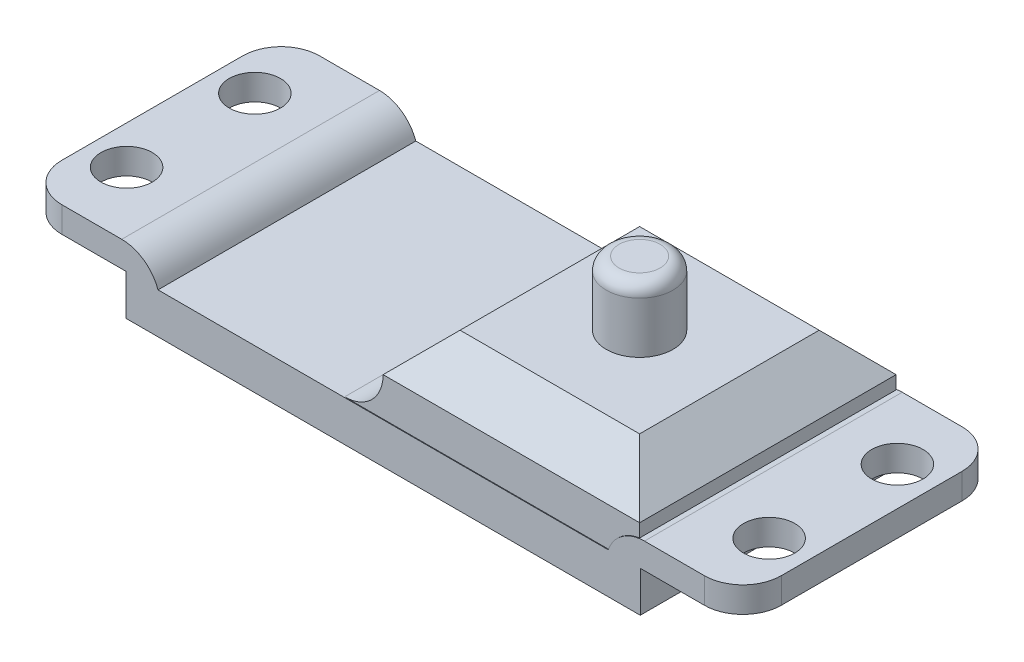
ISO-10303-21;
HEADER;
FILE_DESCRIPTION(('STEP AP214'),'2;1');
FILE_NAME('part.step','',(''),(''),'','','');
FILE_SCHEMA(('AUTOMOTIVE_DESIGN { 1 0 10303 214 1 1 1 1 }'));
ENDSEC;
DATA;
#1=APPLICATION_CONTEXT('core data for automotive mechanical design processes');
#2=APPLICATION_PROTOCOL_DEFINITION('international standard','automotive_design',2000,#1);
#3=PRODUCT_CONTEXT('',#1,'mechanical');
#4=PRODUCT('Part','Part','',(#3));
#5=PRODUCT_RELATED_PRODUCT_CATEGORY('part','',(#4));
#6=PRODUCT_DEFINITION_FORMATION('','',#4);
#7=PRODUCT_DEFINITION_CONTEXT('part definition',#1,'design');
#8=PRODUCT_DEFINITION('design','',#6,#7);
#9=PRODUCT_DEFINITION_SHAPE('','',#8);
#10=(LENGTH_UNIT() NAMED_UNIT(*) SI_UNIT(.MILLI.,.METRE.));
#11=(NAMED_UNIT(*) PLANE_ANGLE_UNIT() SI_UNIT($,.RADIAN.));
#12=(NAMED_UNIT(*) SI_UNIT($,.STERADIAN.) SOLID_ANGLE_UNIT());
#13=UNCERTAINTY_MEASURE_WITH_UNIT(LENGTH_MEASURE(1.E-05),#10,'distance_accuracy_value','');
#14=(GEOMETRIC_REPRESENTATION_CONTEXT(3) GLOBAL_UNCERTAINTY_ASSIGNED_CONTEXT((#13)) GLOBAL_UNIT_ASSIGNED_CONTEXT((#10,
#11,#12)) REPRESENTATION_CONTEXT('',''));
#15=CARTESIAN_POINT('',(0.,0.,0.));
#16=DIRECTION('',(0.,0.,1.));
#17=DIRECTION('',(1.,0.,0.));
#18=AXIS2_PLACEMENT_3D('',#15,#16,#17);
#19=CARTESIAN_POINT('',(0.,3.175,0.));
#20=DIRECTION('',(0.,-1.,0.));
#21=DIRECTION('',(0.,0.,-1.));
#22=AXIS2_PLACEMENT_3D('',#19,#20,#21);
#23=PLANE('',#22);
#24=DIRECTION('',(1.,0.,0.));
#25=VECTOR('',#24,1.);
#26=CARTESIAN_POINT('',(-0.0500000000000025,3.175,10.));
#27=LINE('',#26,#25);
#28=CARTESIAN_POINT('',(-3.05,3.175,10.));
#29=VERTEX_POINT('',#28);
#30=CARTESIAN_POINT('',(17.55,3.175,10.));
#31=VERTEX_POINT('',#30);
#32=EDGE_CURVE('E207',#29,#31,#27,.T.);
#33=ORIENTED_EDGE('',*,*,#32,.F.);
#34=DIRECTION('',(0.,0.,1.));
#35=VECTOR('',#34,1.);
#36=CARTESIAN_POINT('',(-3.05000000000001,3.175,-10.));
#37=LINE('',#36,#35);
#38=CARTESIAN_POINT('',(-3.05000000000001,3.175,-10.));
#39=VERTEX_POINT('',#38);
#40=EDGE_CURVE('E205',#29,#39,#37,.F.);
#41=ORIENTED_EDGE('',*,*,#40,.T.);
#42=DIRECTION('',(-1.,0.,0.));
#43=VECTOR('',#42,1.);
#44=CARTESIAN_POINT('',(-0.0500000000000049,3.175,-10.));
#45=LINE('',#44,#43);
#46=CARTESIAN_POINT('',(17.55,3.175,-10.));
#47=VERTEX_POINT('',#46);
#48=EDGE_CURVE('E190',#47,#39,#45,.T.);
#49=ORIENTED_EDGE('',*,*,#48,.F.);
#50=DIRECTION('',(0.,0.,1.));
#51=VECTOR('',#50,1.);
#52=CARTESIAN_POINT('',(17.55,3.175,-10.05));
#53=LINE('',#52,#51);
#54=CARTESIAN_POINT('',(17.55,3.175,-10.05));
#55=VERTEX_POINT('',#54);
#56=EDGE_CURVE('E202',#55,#47,#53,.T.);
#57=ORIENTED_EDGE('',*,*,#56,.F.);
#58=DIRECTION('',(-1.,0.,0.));
#59=VECTOR('',#58,1.);
#60=CARTESIAN_POINT('',(-20.05,3.175,-10.05));
#61=LINE('',#60,#59);
#62=CARTESIAN_POINT('',(-17.55,3.175,-10.05));
#63=VERTEX_POINT('',#62);
#64=EDGE_CURVE('E223',#55,#63,#61,.T.);
#65=ORIENTED_EDGE('',*,*,#64,.T.);
#66=DIRECTION('',(0.,0.,1.));
#67=VECTOR('',#66,1.);
#68=CARTESIAN_POINT('',(-17.55,3.175,-10.05));
#69=LINE('',#68,#67);
#70=CARTESIAN_POINT('',(-17.55,3.175,10.05));
#71=VERTEX_POINT('',#70);
#72=EDGE_CURVE('E466',#63,#71,#69,.T.);
#73=ORIENTED_EDGE('',*,*,#72,.T.);
#74=DIRECTION('',(1.,0.,0.));
#75=VECTOR('',#74,1.);
#76=CARTESIAN_POINT('',(-20.05,3.175,10.05));
#77=LINE('',#76,#75);
#78=CARTESIAN_POINT('',(17.55,3.175,10.05));
#79=VERTEX_POINT('',#78);
#80=EDGE_CURVE('E225',#71,#79,#77,.T.);
#81=ORIENTED_EDGE('',*,*,#80,.T.);
#82=EDGE_CURVE('E216',#31,#79,#53,.T.);
#83=ORIENTED_EDGE('',*,*,#82,.F.);
#84=EDGE_LOOP('',(#33,#41,#49,#57,#65,#73,#81,#83));
#85=FACE_BOUND('',#84,.T.);
#86=ADVANCED_FACE('F32',(#85),#23,.F.);
#87=CARTESIAN_POINT('',(20.3784271247462,2.175,-10.05));
#88=DIRECTION('',(0.,0.,-1.));
#89=DIRECTION('',(-1.,0.,0.));
#90=AXIS2_PLACEMENT_3D('',#87,#88,#89);
#91=CYLINDRICAL_SURFACE('',#90,3.);
#92=ORIENTED_EDGE('',*,*,#56,.T.);
#93=CARTESIAN_POINT('',(20.3784271247462,2.175,-10.));
#94=DIRECTION('',(0.,0.,1.));
#95=DIRECTION('',(1.,0.,0.));
#96=AXIS2_PLACEMENT_3D('',#93,#94,#95);
#97=CIRCLE('',#96,3.);
#98=CARTESIAN_POINT('',(19.95,5.14425078071585,-10.));
#99=VERTEX_POINT('',#98);
#100=EDGE_CURVE('E187',#47,#99,#97,.F.);
#101=ORIENTED_EDGE('',*,*,#100,.T.);
#102=DIRECTION('',(0.,0.,-1.));
#103=VECTOR('',#102,1.);
#104=CARTESIAN_POINT('',(19.95,5.14425078071585,-10.05));
#105=LINE('',#104,#103);
#106=CARTESIAN_POINT('',(19.95,5.14425078071586,10.));
#107=VERTEX_POINT('',#106);
#108=EDGE_CURVE('E198',#99,#107,#105,.F.);
#109=ORIENTED_EDGE('',*,*,#108,.T.);
#110=CARTESIAN_POINT('',(20.3784271247462,2.175,10.));
#111=DIRECTION('',(0.,0.,-1.));
#112=DIRECTION('',(-1.,0.,0.));
#113=AXIS2_PLACEMENT_3D('',#110,#111,#112);
#114=CIRCLE('',#113,3.);
#115=EDGE_CURVE('E314',#107,#31,#114,.F.);
#116=ORIENTED_EDGE('',*,*,#115,.T.);
#117=ORIENTED_EDGE('',*,*,#82,.T.);
#118=CARTESIAN_POINT('',(20.3784271247462,2.175,10.05));
#119=DIRECTION('',(0.,0.,-1.));
#120=DIRECTION('',(-1.,0.,0.));
#121=AXIS2_PLACEMENT_3D('',#118,#119,#120);
#122=CIRCLE('',#121,3.);
#123=CARTESIAN_POINT('',(20.3784271247462,5.175,10.05));
#124=VERTEX_POINT('',#123);
#125=EDGE_CURVE('E259',#124,#79,#122,.F.);
#126=ORIENTED_EDGE('',*,*,#125,.F.);
#127=DIRECTION('',(0.,0.,-1.));
#128=VECTOR('',#127,1.);
#129=CARTESIAN_POINT('',(20.3784271247462,5.175,0.));
#130=LINE('',#129,#128);
#131=CARTESIAN_POINT('',(20.3784271247462,5.175,-10.05));
#132=VERTEX_POINT('',#131);
#133=EDGE_CURVE('E248',#132,#124,#130,.F.);
#134=ORIENTED_EDGE('',*,*,#133,.F.);
#135=CARTESIAN_POINT('',(20.3784271247462,2.175,-10.05));
#136=DIRECTION('',(0.,0.,1.));
#137=DIRECTION('',(1.,0.,0.));
#138=AXIS2_PLACEMENT_3D('',#135,#136,#137);
#139=CIRCLE('',#138,3.);
#140=EDGE_CURVE('E214',#55,#132,#139,.F.);
#141=ORIENTED_EDGE('',*,*,#140,.F.);
#142=EDGE_LOOP('',(#92,#101,#109,#116,#117,#126,#134,#141));
#143=FACE_BOUND('',#142,.T.);
#144=ADVANCED_FACE('F211',(#143),#91,.T.);
#145=CARTESIAN_POINT('',(20.05,3.175,10.05));
#146=DIRECTION('',(-1.,0.,0.));
#147=DIRECTION('',(0.,0.,1.));
#148=AXIS2_PLACEMENT_3D('',#145,#146,#147);
#149=PLANE('',#148);
#150=DIRECTION('',(0.,0.,-1.));
#151=VECTOR('',#150,1.);
#152=CARTESIAN_POINT('',(20.05,3.175,10.05));
#153=LINE('',#152,#151);
#154=CARTESIAN_POINT('',(20.05,3.175,10.05));
#155=VERTEX_POINT('',#154);
#156=CARTESIAN_POINT('',(20.05,3.175,-10.05));
#157=VERTEX_POINT('',#156);
#158=EDGE_CURVE('E256',#155,#157,#153,.T.);
#159=ORIENTED_EDGE('',*,*,#158,.F.);
#160=DIRECTION('',(0.,-1.,0.));
#161=VECTOR('',#160,1.);
#162=CARTESIAN_POINT('',(20.05,3.175,10.05));
#163=LINE('',#162,#161);
#164=CARTESIAN_POINT('',(20.05,0.,10.05));
#165=VERTEX_POINT('',#164);
#166=EDGE_CURVE('E229',#155,#165,#163,.T.);
#167=ORIENTED_EDGE('',*,*,#166,.T.);
#168=DIRECTION('',(0.,0.,-1.));
#169=VECTOR('',#168,1.);
#170=CARTESIAN_POINT('',(20.05,0.,10.05));
#171=LINE('',#170,#169);
#172=CARTESIAN_POINT('',(20.05,0.,-10.05));
#173=VERTEX_POINT('',#172);
#174=EDGE_CURVE('E230',#165,#173,#171,.T.);
#175=ORIENTED_EDGE('',*,*,#174,.T.);
#176=DIRECTION('',(0.,-1.,0.));
#177=VECTOR('',#176,1.);
#178=CARTESIAN_POINT('',(20.05,3.175,-10.05));
#179=LINE('',#178,#177);
#180=EDGE_CURVE('E246',#157,#173,#179,.T.);
#181=ORIENTED_EDGE('',*,*,#180,.F.);
#182=EDGE_LOOP('',(#159,#167,#175,#181));
#183=FACE_BOUND('',#182,.T.);
#184=ADVANCED_FACE('F368',(#183),#149,.F.);
#185=CARTESIAN_POINT('',(-20.05,3.175,-10.05));
#186=DIRECTION('',(0.,0.,1.));
#187=DIRECTION('',(1.,0.,0.));
#188=AXIS2_PLACEMENT_3D('',#185,#186,#187);
#189=PLANE('',#188);
#190=DIRECTION('',(1.,0.,0.));
#191=VECTOR('',#190,1.);
#192=CARTESIAN_POINT('',(-28.05,3.175,-10.05));
#193=LINE('',#192,#191);
#194=CARTESIAN_POINT('',(-25.05,3.175,-10.05));
#195=VERTEX_POINT('',#194);
#196=CARTESIAN_POINT('',(-20.05,3.175,-10.05));
#197=VERTEX_POINT('',#196);
#198=EDGE_CURVE('E464',#195,#197,#193,.T.);
#199=ORIENTED_EDGE('',*,*,#198,.F.);
#200=DIRECTION('',(0.,1.,0.));
#201=VECTOR('',#200,1.);
#202=CARTESIAN_POINT('',(-25.05,5.175,-10.05));
#203=LINE('',#202,#201);
#204=CARTESIAN_POINT('',(-25.05,5.175,-10.05));
#205=VERTEX_POINT('',#204);
#206=EDGE_CURVE('E296',#195,#205,#203,.T.);
#207=ORIENTED_EDGE('',*,*,#206,.T.);
#208=DIRECTION('',(1.,0.,0.));
#209=VECTOR('',#208,1.);
#210=CARTESIAN_POINT('',(-20.05,5.175,-10.05));
#211=LINE('',#210,#209);
#212=CARTESIAN_POINT('',(-20.3784271247462,5.175,-10.05));
#213=VERTEX_POINT('',#212);
#214=EDGE_CURVE('E470',#205,#213,#211,.T.);
#215=ORIENTED_EDGE('',*,*,#214,.T.);
#216=CARTESIAN_POINT('',(-20.3784271247462,2.175,-10.05));
#217=DIRECTION('',(0.,0.,1.));
#218=DIRECTION('',(1.,0.,0.));
#219=AXIS2_PLACEMENT_3D('',#216,#217,#218);
#220=CIRCLE('',#219,3.);
#221=EDGE_CURVE('E294',#213,#63,#220,.F.);
#222=ORIENTED_EDGE('',*,*,#221,.T.);
#223=ORIENTED_EDGE('',*,*,#64,.F.);
#224=ORIENTED_EDGE('',*,*,#140,.T.);
#225=DIRECTION('',(-1.,0.,0.));
#226=VECTOR('',#225,1.);
#227=CARTESIAN_POINT('',(20.05,5.175,-10.05));
#228=LINE('',#227,#226);
#229=CARTESIAN_POINT('',(25.05,5.175,-10.05));
#230=VERTEX_POINT('',#229);
#231=EDGE_CURVE('E215',#230,#132,#228,.T.);
#232=ORIENTED_EDGE('',*,*,#231,.F.);
#233=DIRECTION('',(0.,1.,0.));
#234=VECTOR('',#233,1.);
#235=CARTESIAN_POINT('',(25.05,3.175,-10.05));
#236=LINE('',#235,#234);
#237=CARTESIAN_POINT('',(25.05,3.175,-10.05));
#238=VERTEX_POINT('',#237);
#239=EDGE_CURVE('E273',#230,#238,#236,.F.);
#240=ORIENTED_EDGE('',*,*,#239,.T.);
#241=DIRECTION('',(-1.,0.,0.));
#242=VECTOR('',#241,1.);
#243=CARTESIAN_POINT('',(28.05,3.175,-10.05));
#244=LINE('',#243,#242);
#245=EDGE_CURVE('E485',#238,#157,#244,.T.);
#246=ORIENTED_EDGE('',*,*,#245,.T.);
#247=ORIENTED_EDGE('',*,*,#180,.T.);
#248=DIRECTION('',(-1.,0.,0.));
#249=VECTOR('',#248,1.);
#250=CARTESIAN_POINT('',(-20.05,0.,-10.05));
#251=LINE('',#250,#249);
#252=CARTESIAN_POINT('',(-20.05,0.,-10.05));
#253=VERTEX_POINT('',#252);
#254=EDGE_CURVE('E233',#173,#253,#251,.T.);
#255=ORIENTED_EDGE('',*,*,#254,.T.);
#256=DIRECTION('',(0.,-1.,0.));
#257=VECTOR('',#256,1.);
#258=CARTESIAN_POINT('',(-20.05,3.175,-10.05));
#259=LINE('',#258,#257);
#260=EDGE_CURVE('E244',#197,#253,#259,.T.);
#261=ORIENTED_EDGE('',*,*,#260,.F.);
#262=EDGE_LOOP('',(#199,#207,#215,#222,#223,#224,#232,#240,#246,#247,#255,#261));
#263=FACE_BOUND('',#262,.T.);
#264=ADVANCED_FACE('F385',(#263),#189,.F.);
#265=CARTESIAN_POINT('',(-20.05,3.175,10.05));
#266=DIRECTION('',(1.,0.,0.));
#267=DIRECTION('',(0.,0.,-1.));
#268=AXIS2_PLACEMENT_3D('',#265,#266,#267);
#269=PLANE('',#268);
#270=DIRECTION('',(0.,-1.,0.));
#271=VECTOR('',#270,1.);
#272=CARTESIAN_POINT('',(-20.05,3.175,10.05));
#273=LINE('',#272,#271);
#274=CARTESIAN_POINT('',(-20.05,3.175,10.05));
#275=VERTEX_POINT('',#274);
#276=CARTESIAN_POINT('',(-20.05,0.,10.05));
#277=VERTEX_POINT('',#276);
#278=EDGE_CURVE('E242',#275,#277,#273,.T.);
#279=ORIENTED_EDGE('',*,*,#278,.F.);
#280=DIRECTION('',(0.,0.,-1.));
#281=VECTOR('',#280,1.);
#282=CARTESIAN_POINT('',(-20.05,3.175,10.05));
#283=LINE('',#282,#281);
#284=EDGE_CURVE('E289',#275,#197,#283,.T.);
#285=ORIENTED_EDGE('',*,*,#284,.T.);
#286=ORIENTED_EDGE('',*,*,#260,.T.);
#287=DIRECTION('',(0.,0.,1.));
#288=VECTOR('',#287,1.);
#289=CARTESIAN_POINT('',(-20.05,0.,10.05));
#290=LINE('',#289,#288);
#291=EDGE_CURVE('E236',#253,#277,#290,.T.);
#292=ORIENTED_EDGE('',*,*,#291,.T.);
#293=EDGE_LOOP('',(#279,#285,#286,#292));
#294=FACE_BOUND('',#293,.T.);
#295=ADVANCED_FACE('F381',(#294),#269,.F.);
#296=CARTESIAN_POINT('',(-20.05,3.175,10.05));
#297=DIRECTION('',(0.,0.,-1.));
#298=DIRECTION('',(-1.,0.,0.));
#299=AXIS2_PLACEMENT_3D('',#296,#297,#298);
#300=PLANE('',#299);
#301=DIRECTION('',(-1.,0.,0.));
#302=VECTOR('',#301,1.);
#303=CARTESIAN_POINT('',(-20.05,5.175,10.05));
#304=LINE('',#303,#302);
#305=CARTESIAN_POINT('',(-20.3784271247462,5.175,10.05));
#306=VERTEX_POINT('',#305);
#307=CARTESIAN_POINT('',(-25.05,5.175,10.05));
#308=VERTEX_POINT('',#307);
#309=EDGE_CURVE('E467',#306,#308,#304,.T.);
#310=ORIENTED_EDGE('',*,*,#309,.T.);
#311=DIRECTION('',(0.,-1.,0.));
#312=VECTOR('',#311,1.);
#313=CARTESIAN_POINT('',(-25.05,3.175,10.05));
#314=LINE('',#313,#312);
#315=CARTESIAN_POINT('',(-25.05,3.175,10.05));
#316=VERTEX_POINT('',#315);
#317=EDGE_CURVE('E311',#308,#316,#314,.T.);
#318=ORIENTED_EDGE('',*,*,#317,.T.);
#319=DIRECTION('',(1.,0.,0.));
#320=VECTOR('',#319,1.);
#321=CARTESIAN_POINT('',(-28.05,3.175,10.05));
#322=LINE('',#321,#320);
#323=EDGE_CURVE('E460',#316,#275,#322,.T.);
#324=ORIENTED_EDGE('',*,*,#323,.T.);
#325=ORIENTED_EDGE('',*,*,#278,.T.);
#326=DIRECTION('',(1.,0.,0.));
#327=VECTOR('',#326,1.);
#328=CARTESIAN_POINT('',(-20.05,0.,10.05));
#329=LINE('',#328,#327);
#330=EDGE_CURVE('E226',#277,#165,#329,.T.);
#331=ORIENTED_EDGE('',*,*,#330,.T.);
#332=ORIENTED_EDGE('',*,*,#166,.F.);
#333=DIRECTION('',(-1.,0.,0.));
#334=VECTOR('',#333,1.);
#335=CARTESIAN_POINT('',(28.05,3.175,10.05));
#336=LINE('',#335,#334);
#337=CARTESIAN_POINT('',(25.05,3.175,10.05));
#338=VERTEX_POINT('',#337);
#339=EDGE_CURVE('E220',#338,#155,#336,.T.);
#340=ORIENTED_EDGE('',*,*,#339,.F.);
#341=DIRECTION('',(0.,-1.,0.));
#342=VECTOR('',#341,1.);
#343=CARTESIAN_POINT('',(25.05,5.175,10.05));
#344=LINE('',#343,#342);
#345=CARTESIAN_POINT('',(25.05,5.175,10.05));
#346=VERTEX_POINT('',#345);
#347=EDGE_CURVE('E279',#338,#346,#344,.F.);
#348=ORIENTED_EDGE('',*,*,#347,.T.);
#349=DIRECTION('',(1.,0.,0.));
#350=VECTOR('',#349,1.);
#351=CARTESIAN_POINT('',(20.05,5.175,10.05));
#352=LINE('',#351,#350);
#353=EDGE_CURVE('E218',#124,#346,#352,.T.);
#354=ORIENTED_EDGE('',*,*,#353,.F.);
#355=ORIENTED_EDGE('',*,*,#125,.T.);
#356=ORIENTED_EDGE('',*,*,#80,.F.);
#357=CARTESIAN_POINT('',(-20.3784271247462,2.175,10.05));
#358=DIRECTION('',(0.,0.,-1.));
#359=DIRECTION('',(-1.,0.,0.));
#360=AXIS2_PLACEMENT_3D('',#357,#358,#359);
#361=CIRCLE('',#360,3.);
#362=EDGE_CURVE('E281',#71,#306,#361,.F.);
#363=ORIENTED_EDGE('',*,*,#362,.T.);
#364=EDGE_LOOP('',(#310,#318,#324,#325,#331,#332,#340,#348,#354,#355,#356,#363));
#365=FACE_BOUND('',#364,.T.);
#366=ADVANCED_FACE('F377',(#365),#300,.F.);
#367=CARTESIAN_POINT('',(0.,0.,0.));
#368=DIRECTION('',(0.,-1.,0.));
#369=DIRECTION('',(0.,0.,-1.));
#370=AXIS2_PLACEMENT_3D('',#367,#368,#369);
#371=PLANE('',#370);
#372=ORIENTED_EDGE('',*,*,#174,.F.);
#373=ORIENTED_EDGE('',*,*,#330,.F.);
#374=ORIENTED_EDGE('',*,*,#291,.F.);
#375=ORIENTED_EDGE('',*,*,#254,.F.);
#376=EDGE_LOOP('',(#372,#373,#374,#375));
#377=FACE_BOUND('',#376,.T.);
#378=ADVANCED_FACE('F374',(#377),#371,.T.);
#379=CARTESIAN_POINT('',(0.,5.175,0.));
#380=DIRECTION('',(0.,-1.,0.));
#381=DIRECTION('',(0.,0.,-1.));
#382=AXIS2_PLACEMENT_3D('',#379,#380,#381);
#383=PLANE('',#382);
#384=CARTESIAN_POINT('',(25.05,5.175,5.));
#385=DIRECTION('',(0.,-1.,0.));
#386=DIRECTION('',(0.,0.,-1.));
#387=AXIS2_PLACEMENT_3D('',#384,#385,#386);
#388=CIRCLE('',#387,2.);
#389=CARTESIAN_POINT('',(25.05,5.175,3.));
#390=VERTEX_POINT('',#389);
#391=EDGE_CURVE('E253',#390,#390,#388,.T.);
#392=ORIENTED_EDGE('',*,*,#391,.T.);
#393=EDGE_LOOP('',(#392));
#394=FACE_BOUND('',#393,.T.);
#395=CARTESIAN_POINT('',(25.05,5.175,-5.));
#396=DIRECTION('',(0.,-1.,0.));
#397=DIRECTION('',(0.,0.,-1.));
#398=AXIS2_PLACEMENT_3D('',#395,#396,#397);
#399=CIRCLE('',#398,2.);
#400=CARTESIAN_POINT('',(25.05,5.175,-7.));
#401=VERTEX_POINT('',#400);
#402=EDGE_CURVE('E472',#401,#401,#399,.T.);
#403=ORIENTED_EDGE('',*,*,#402,.T.);
#404=EDGE_LOOP('',(#403));
#405=FACE_BOUND('',#404,.T.);
#406=DIRECTION('',(0.,0.,1.));
#407=VECTOR('',#406,1.);
#408=CARTESIAN_POINT('',(28.05,5.175,10.05));
#409=LINE('',#408,#407);
#410=CARTESIAN_POINT('',(28.05,5.175,-7.05));
#411=VERTEX_POINT('',#410);
#412=CARTESIAN_POINT('',(28.05,5.175,7.05));
#413=VERTEX_POINT('',#412);
#414=EDGE_CURVE('E482',#411,#413,#409,.T.);
#415=ORIENTED_EDGE('',*,*,#414,.F.);
#416=CARTESIAN_POINT('',(25.05,5.175,-7.05));
#417=DIRECTION('',(0.,-1.,0.));
#418=DIRECTION('',(0.,0.,-1.));
#419=AXIS2_PLACEMENT_3D('',#416,#417,#418);
#420=CIRCLE('',#419,3.);
#421=EDGE_CURVE('E271',#411,#230,#420,.F.);
#422=ORIENTED_EDGE('',*,*,#421,.T.);
#423=ORIENTED_EDGE('',*,*,#231,.T.);
#424=ORIENTED_EDGE('',*,*,#133,.T.);
#425=ORIENTED_EDGE('',*,*,#353,.T.);
#426=CARTESIAN_POINT('',(25.05,5.175,7.05));
#427=DIRECTION('',(0.,-1.,0.));
#428=DIRECTION('',(0.,0.,-1.));
#429=AXIS2_PLACEMENT_3D('',#426,#427,#428);
#430=CIRCLE('',#429,3.);
#431=EDGE_CURVE('E269',#346,#413,#430,.F.);
#432=ORIENTED_EDGE('',*,*,#431,.T.);
#433=EDGE_LOOP('',(#415,#422,#423,#424,#425,#432));
#434=FACE_BOUND('',#433,.T.);
#435=ADVANCED_FACE('F372',(#394,#405,#434),#383,.F.);
#436=CARTESIAN_POINT('',(28.05,3.175,10.05));
#437=DIRECTION('',(0.,1.,0.));
#438=DIRECTION('',(0.,0.,1.));
#439=AXIS2_PLACEMENT_3D('',#436,#437,#438);
#440=PLANE('',#439);
#441=CARTESIAN_POINT('',(25.05,3.175,5.));
#442=DIRECTION('',(0.,1.,0.));
#443=DIRECTION('',(0.,0.,1.));
#444=AXIS2_PLACEMENT_3D('',#441,#442,#443);
#445=CIRCLE('',#444,2.);
#446=CARTESIAN_POINT('',(25.05,3.175,7.));
#447=VERTEX_POINT('',#446);
#448=EDGE_CURVE('E252',#447,#447,#445,.T.);
#449=ORIENTED_EDGE('',*,*,#448,.T.);
#450=EDGE_LOOP('',(#449));
#451=FACE_BOUND('',#450,.T.);
#452=CARTESIAN_POINT('',(25.05,3.175,-5.));
#453=DIRECTION('',(0.,1.,0.));
#454=DIRECTION('',(0.,0.,1.));
#455=AXIS2_PLACEMENT_3D('',#452,#453,#454);
#456=CIRCLE('',#455,2.);
#457=CARTESIAN_POINT('',(25.05,3.175,-3.));
#458=VERTEX_POINT('',#457);
#459=EDGE_CURVE('E249',#458,#458,#456,.T.);
#460=ORIENTED_EDGE('',*,*,#459,.T.);
#461=EDGE_LOOP('',(#460));
#462=FACE_BOUND('',#461,.T.);
#463=ORIENTED_EDGE('',*,*,#245,.F.);
#464=CARTESIAN_POINT('',(25.05,3.175,-7.05));
#465=DIRECTION('',(0.,1.,0.));
#466=DIRECTION('',(0.,0.,1.));
#467=AXIS2_PLACEMENT_3D('',#464,#465,#466);
#468=CIRCLE('',#467,3.);
#469=CARTESIAN_POINT('',(28.05,3.175,-7.05));
#470=VERTEX_POINT('',#469);
#471=EDGE_CURVE('E277',#238,#470,#468,.F.);
#472=ORIENTED_EDGE('',*,*,#471,.T.);
#473=DIRECTION('',(0.,0.,-1.));
#474=VECTOR('',#473,1.);
#475=CARTESIAN_POINT('',(28.05,3.175,10.05));
#476=LINE('',#475,#474);
#477=CARTESIAN_POINT('',(28.05,3.175,7.05));
#478=VERTEX_POINT('',#477);
#479=EDGE_CURVE('E479',#478,#470,#476,.T.);
#480=ORIENTED_EDGE('',*,*,#479,.F.);
#481=CARTESIAN_POINT('',(25.05,3.175,7.05));
#482=DIRECTION('',(0.,1.,0.));
#483=DIRECTION('',(0.,0.,1.));
#484=AXIS2_PLACEMENT_3D('',#481,#482,#483);
#485=CIRCLE('',#484,3.);
#486=EDGE_CURVE('E275',#478,#338,#485,.F.);
#487=ORIENTED_EDGE('',*,*,#486,.T.);
#488=ORIENTED_EDGE('',*,*,#339,.T.);
#489=ORIENTED_EDGE('',*,*,#158,.T.);
#490=EDGE_LOOP('',(#463,#472,#480,#487,#488,#489));
#491=FACE_BOUND('',#490,.T.);
#492=ADVANCED_FACE('F493',(#451,#462,#491),#440,.F.);
#493=CARTESIAN_POINT('',(28.05,0.,0.));
#494=DIRECTION('',(1.,0.,0.));
#495=DIRECTION('',(0.,0.,-1.));
#496=AXIS2_PLACEMENT_3D('',#493,#494,#495);
#497=PLANE('',#496);
#498=ORIENTED_EDGE('',*,*,#479,.T.);
#499=DIRECTION('',(0.,1.,0.));
#500=VECTOR('',#499,1.);
#501=CARTESIAN_POINT('',(28.05,5.175,-7.05));
#502=LINE('',#501,#500);
#503=EDGE_CURVE('E266',#470,#411,#502,.T.);
#504=ORIENTED_EDGE('',*,*,#503,.T.);
#505=ORIENTED_EDGE('',*,*,#414,.T.);
#506=DIRECTION('',(0.,-1.,0.));
#507=VECTOR('',#506,1.);
#508=CARTESIAN_POINT('',(28.05,3.175,7.05));
#509=LINE('',#508,#507);
#510=EDGE_CURVE('E263',#413,#478,#509,.T.);
#511=ORIENTED_EDGE('',*,*,#510,.T.);
#512=EDGE_LOOP('',(#498,#504,#505,#511));
#513=FACE_BOUND('',#512,.T.);
#514=ADVANCED_FACE('F511',(#513),#497,.T.);
#515=CARTESIAN_POINT('',(25.05,5.175,-5.));
#516=DIRECTION('',(0.,-1.,0.));
#517=DIRECTION('',(0.,0.,-1.));
#518=AXIS2_PLACEMENT_3D('',#515,#516,#517);
#519=CYLINDRICAL_SURFACE('',#518,2.);
#520=ORIENTED_EDGE('',*,*,#402,.F.);
#521=EDGE_LOOP('',(#520));
#522=FACE_BOUND('',#521,.T.);
#523=ORIENTED_EDGE('',*,*,#459,.F.);
#524=EDGE_LOOP('',(#523));
#525=FACE_BOUND('',#524,.T.);
#526=ADVANCED_FACE('F557',(#522,#525),#519,.F.);
#527=CARTESIAN_POINT('',(25.05,5.175,5.));
#528=DIRECTION('',(0.,-1.,0.));
#529=DIRECTION('',(0.,0.,-1.));
#530=AXIS2_PLACEMENT_3D('',#527,#528,#529);
#531=CYLINDRICAL_SURFACE('',#530,2.);
#532=ORIENTED_EDGE('',*,*,#391,.F.);
#533=EDGE_LOOP('',(#532));
#534=FACE_BOUND('',#533,.T.);
#535=ORIENTED_EDGE('',*,*,#448,.F.);
#536=EDGE_LOOP('',(#535));
#537=FACE_BOUND('',#536,.T.);
#538=ADVANCED_FACE('F397',(#534,#537),#531,.F.);
#539=CARTESIAN_POINT('',(25.05,0.,-7.05));
#540=DIRECTION('',(0.,-1.,0.));
#541=DIRECTION('',(0.,0.,-1.));
#542=AXIS2_PLACEMENT_3D('',#539,#540,#541);
#543=CYLINDRICAL_SURFACE('',#542,3.);
#544=ORIENTED_EDGE('',*,*,#471,.F.);
#545=ORIENTED_EDGE('',*,*,#239,.F.);
#546=ORIENTED_EDGE('',*,*,#421,.F.);
#547=ORIENTED_EDGE('',*,*,#503,.F.);
#548=EDGE_LOOP('',(#544,#545,#546,#547));
#549=FACE_BOUND('',#548,.T.);
#550=ADVANCED_FACE('F393',(#549),#543,.T.);
#551=CARTESIAN_POINT('',(25.05,0.,7.05));
#552=DIRECTION('',(0.,1.,0.));
#553=DIRECTION('',(0.,0.,1.));
#554=AXIS2_PLACEMENT_3D('',#551,#552,#553);
#555=CYLINDRICAL_SURFACE('',#554,3.);
#556=ORIENTED_EDGE('',*,*,#431,.F.);
#557=ORIENTED_EDGE('',*,*,#347,.F.);
#558=ORIENTED_EDGE('',*,*,#486,.F.);
#559=ORIENTED_EDGE('',*,*,#510,.F.);
#560=EDGE_LOOP('',(#556,#557,#558,#559));
#561=FACE_BOUND('',#560,.T.);
#562=ADVANCED_FACE('F396',(#561),#555,.T.);
#563=CARTESIAN_POINT('',(0.,5.175,0.));
#564=DIRECTION('',(0.,-1.,0.));
#565=DIRECTION('',(0.,0.,-1.));
#566=AXIS2_PLACEMENT_3D('',#563,#564,#565);
#567=PLANE('',#566);
#568=CARTESIAN_POINT('',(-25.05,5.175,5.));
#569=DIRECTION('',(0.,1.,0.));
#570=DIRECTION('',(0.,0.,-1.));
#571=AXIS2_PLACEMENT_3D('',#568,#569,#570);
#572=CIRCLE('',#571,2.);
#573=CARTESIAN_POINT('',(-25.05,5.175,3.));
#574=VERTEX_POINT('',#573);
#575=EDGE_CURVE('E286',#574,#574,#572,.T.);
#576=ORIENTED_EDGE('',*,*,#575,.F.);
#577=EDGE_LOOP('',(#576));
#578=FACE_BOUND('',#577,.T.);
#579=CARTESIAN_POINT('',(-25.05,5.175,-5.));
#580=DIRECTION('',(0.,1.,0.));
#581=DIRECTION('',(0.,0.,-1.));
#582=AXIS2_PLACEMENT_3D('',#579,#580,#581);
#583=CIRCLE('',#582,2.);
#584=CARTESIAN_POINT('',(-25.05,5.175,-7.));
#585=VERTEX_POINT('',#584);
#586=EDGE_CURVE('E446',#585,#585,#583,.T.);
#587=ORIENTED_EDGE('',*,*,#586,.F.);
#588=EDGE_LOOP('',(#587));
#589=FACE_BOUND('',#588,.T.);
#590=ORIENTED_EDGE('',*,*,#214,.F.);
#591=CARTESIAN_POINT('',(-25.05,5.175,-7.05));
#592=DIRECTION('',(0.,-1.,0.));
#593=DIRECTION('',(0.,0.,-1.));
#594=AXIS2_PLACEMENT_3D('',#591,#592,#593);
#595=CIRCLE('',#594,3.);
#596=CARTESIAN_POINT('',(-28.05,5.175,-7.05));
#597=VERTEX_POINT('',#596);
#598=EDGE_CURVE('E301',#205,#597,#595,.F.);
#599=ORIENTED_EDGE('',*,*,#598,.T.);
#600=DIRECTION('',(0.,0.,1.));
#601=VECTOR('',#600,1.);
#602=CARTESIAN_POINT('',(-28.05,5.175,10.05));
#603=LINE('',#602,#601);
#604=CARTESIAN_POINT('',(-28.05,5.175,7.05));
#605=VERTEX_POINT('',#604);
#606=EDGE_CURVE('E454',#597,#605,#603,.T.);
#607=ORIENTED_EDGE('',*,*,#606,.T.);
#608=CARTESIAN_POINT('',(-25.05,5.175,7.05));
#609=DIRECTION('',(0.,-1.,0.));
#610=DIRECTION('',(0.,0.,-1.));
#611=AXIS2_PLACEMENT_3D('',#608,#609,#610);
#612=CIRCLE('',#611,3.);
#613=EDGE_CURVE('E299',#605,#308,#612,.F.);
#614=ORIENTED_EDGE('',*,*,#613,.T.);
#615=ORIENTED_EDGE('',*,*,#309,.F.);
#616=DIRECTION('',(0.,0.,-1.));
#617=VECTOR('',#616,1.);
#618=CARTESIAN_POINT('',(-20.3784271247462,5.175,0.));
#619=LINE('',#618,#617);
#620=EDGE_CURVE('E291',#306,#213,#619,.T.);
#621=ORIENTED_EDGE('',*,*,#620,.T.);
#622=EDGE_LOOP('',(#590,#599,#607,#614,#615,#621));
#623=FACE_BOUND('',#622,.T.);
#624=ADVANCED_FACE('F401',(#578,#589,#623),#567,.F.);
#625=CARTESIAN_POINT('',(-28.05,3.175,10.05));
#626=DIRECTION('',(0.,-1.,0.));
#627=DIRECTION('',(0.,0.,-1.));
#628=AXIS2_PLACEMENT_3D('',#625,#626,#627);
#629=PLANE('',#628);
#630=CARTESIAN_POINT('',(-25.05,3.175,5.));
#631=DIRECTION('',(0.,-1.,0.));
#632=DIRECTION('',(0.,0.,-1.));
#633=AXIS2_PLACEMENT_3D('',#630,#631,#632);
#634=CIRCLE('',#633,2.);
#635=CARTESIAN_POINT('',(-25.05,3.175,3.));
#636=VERTEX_POINT('',#635);
#637=EDGE_CURVE('E285',#636,#636,#634,.F.);
#638=ORIENTED_EDGE('',*,*,#637,.T.);
#639=EDGE_LOOP('',(#638));
#640=FACE_BOUND('',#639,.T.);
#641=CARTESIAN_POINT('',(-25.05,3.175,-5.));
#642=DIRECTION('',(0.,-1.,0.));
#643=DIRECTION('',(0.,0.,-1.));
#644=AXIS2_PLACEMENT_3D('',#641,#642,#643);
#645=CIRCLE('',#644,2.);
#646=CARTESIAN_POINT('',(-25.05,3.175,-7.));
#647=VERTEX_POINT('',#646);
#648=EDGE_CURVE('E282',#647,#647,#645,.F.);
#649=ORIENTED_EDGE('',*,*,#648,.T.);
#650=EDGE_LOOP('',(#649));
#651=FACE_BOUND('',#650,.T.);
#652=DIRECTION('',(0.,0.,-1.));
#653=VECTOR('',#652,1.);
#654=CARTESIAN_POINT('',(-28.05,3.175,10.05));
#655=LINE('',#654,#653);
#656=CARTESIAN_POINT('',(-28.05,3.175,7.05));
#657=VERTEX_POINT('',#656);
#658=CARTESIAN_POINT('',(-28.05,3.175,-7.05));
#659=VERTEX_POINT('',#658);
#660=EDGE_CURVE('E457',#657,#659,#655,.T.);
#661=ORIENTED_EDGE('',*,*,#660,.T.);
#662=CARTESIAN_POINT('',(-25.05,3.175,-7.05));
#663=DIRECTION('',(0.,-1.,0.));
#664=DIRECTION('',(0.,0.,-1.));
#665=AXIS2_PLACEMENT_3D('',#662,#663,#664);
#666=CIRCLE('',#665,3.);
#667=EDGE_CURVE('E309',#659,#195,#666,.T.);
#668=ORIENTED_EDGE('',*,*,#667,.T.);
#669=ORIENTED_EDGE('',*,*,#198,.T.);
#670=ORIENTED_EDGE('',*,*,#284,.F.);
#671=ORIENTED_EDGE('',*,*,#323,.F.);
#672=CARTESIAN_POINT('',(-25.05,3.175,7.05));
#673=DIRECTION('',(0.,-1.,0.));
#674=DIRECTION('',(0.,0.,-1.));
#675=AXIS2_PLACEMENT_3D('',#672,#673,#674);
#676=CIRCLE('',#675,3.);
#677=EDGE_CURVE('E307',#316,#657,#676,.T.);
#678=ORIENTED_EDGE('',*,*,#677,.T.);
#679=EDGE_LOOP('',(#661,#668,#669,#670,#671,#678));
#680=FACE_BOUND('',#679,.T.);
#681=ADVANCED_FACE('F532',(#640,#651,#680),#629,.T.);
#682=CARTESIAN_POINT('',(-28.05,0.,0.));
#683=DIRECTION('',(-1.,0.,0.));
#684=DIRECTION('',(0.,0.,-1.));
#685=AXIS2_PLACEMENT_3D('',#682,#683,#684);
#686=PLANE('',#685);
#687=ORIENTED_EDGE('',*,*,#606,.F.);
#688=DIRECTION('',(0.,1.,0.));
#689=VECTOR('',#688,1.);
#690=CARTESIAN_POINT('',(-28.05,3.175,-7.05));
#691=LINE('',#690,#689);
#692=EDGE_CURVE('E305',#597,#659,#691,.F.);
#693=ORIENTED_EDGE('',*,*,#692,.T.);
#694=ORIENTED_EDGE('',*,*,#660,.F.);
#695=DIRECTION('',(0.,-1.,0.));
#696=VECTOR('',#695,1.);
#697=CARTESIAN_POINT('',(-28.05,5.175,7.05));
#698=LINE('',#697,#696);
#699=EDGE_CURVE('E303',#657,#605,#698,.F.);
#700=ORIENTED_EDGE('',*,*,#699,.T.);
#701=EDGE_LOOP('',(#687,#693,#694,#700));
#702=FACE_BOUND('',#701,.T.);
#703=ADVANCED_FACE('F538',(#702),#686,.T.);
#704=CARTESIAN_POINT('',(-25.05,5.175,-5.));
#705=DIRECTION('',(0.,-1.,0.));
#706=DIRECTION('',(0.,0.,-1.));
#707=AXIS2_PLACEMENT_3D('',#704,#705,#706);
#708=CYLINDRICAL_SURFACE('',#707,2.);
#709=ORIENTED_EDGE('',*,*,#648,.F.);
#710=EDGE_LOOP('',(#709));
#711=FACE_BOUND('',#710,.T.);
#712=ORIENTED_EDGE('',*,*,#586,.T.);
#713=EDGE_LOOP('',(#712));
#714=FACE_BOUND('',#713,.T.);
#715=ADVANCED_FACE('F540',(#711,#714),#708,.F.);
#716=CARTESIAN_POINT('',(-25.05,5.175,5.));
#717=DIRECTION('',(0.,-1.,0.));
#718=DIRECTION('',(0.,0.,-1.));
#719=AXIS2_PLACEMENT_3D('',#716,#717,#718);
#720=CYLINDRICAL_SURFACE('',#719,2.);
#721=ORIENTED_EDGE('',*,*,#637,.F.);
#722=EDGE_LOOP('',(#721));
#723=FACE_BOUND('',#722,.T.);
#724=ORIENTED_EDGE('',*,*,#575,.T.);
#725=EDGE_LOOP('',(#724));
#726=FACE_BOUND('',#725,.T.);
#727=ADVANCED_FACE('F407',(#723,#726),#720,.F.);
#728=CARTESIAN_POINT('',(-20.3784271247462,2.175,-10.05));
#729=DIRECTION('',(0.,0.,-1.));
#730=DIRECTION('',(-1.,0.,0.));
#731=AXIS2_PLACEMENT_3D('',#728,#729,#730);
#732=CYLINDRICAL_SURFACE('',#731,3.);
#733=ORIENTED_EDGE('',*,*,#221,.F.);
#734=ORIENTED_EDGE('',*,*,#620,.F.);
#735=ORIENTED_EDGE('',*,*,#362,.F.);
#736=ORIENTED_EDGE('',*,*,#72,.F.);
#737=EDGE_LOOP('',(#733,#734,#735,#736));
#738=FACE_BOUND('',#737,.T.);
#739=ADVANCED_FACE('F403',(#738),#732,.T.);
#740=CARTESIAN_POINT('',(-25.05,3.175,-7.05));
#741=DIRECTION('',(0.,-1.,0.));
#742=DIRECTION('',(0.,0.,-1.));
#743=AXIS2_PLACEMENT_3D('',#740,#741,#742);
#744=CYLINDRICAL_SURFACE('',#743,3.);
#745=ORIENTED_EDGE('',*,*,#667,.F.);
#746=ORIENTED_EDGE('',*,*,#692,.F.);
#747=ORIENTED_EDGE('',*,*,#598,.F.);
#748=ORIENTED_EDGE('',*,*,#206,.F.);
#749=EDGE_LOOP('',(#745,#746,#747,#748));
#750=FACE_BOUND('',#749,.T.);
#751=ADVANCED_FACE('F406',(#750),#744,.T.);
#752=CARTESIAN_POINT('',(-25.05,3.175,7.05));
#753=DIRECTION('',(0.,1.,0.));
#754=DIRECTION('',(0.,0.,1.));
#755=AXIS2_PLACEMENT_3D('',#752,#753,#754);
#756=CYLINDRICAL_SURFACE('',#755,3.);
#757=ORIENTED_EDGE('',*,*,#613,.F.);
#758=ORIENTED_EDGE('',*,*,#699,.F.);
#759=ORIENTED_EDGE('',*,*,#677,.F.);
#760=ORIENTED_EDGE('',*,*,#317,.F.);
#761=EDGE_LOOP('',(#757,#758,#759,#760));
#762=FACE_BOUND('',#761,.T.);
#763=ADVANCED_FACE('F411',(#762),#756,.T.);
#764=CARTESIAN_POINT('',(19.95,9.175,-10.));
#765=DIRECTION('',(-1.,0.,0.));
#766=DIRECTION('',(0.,0.,1.));
#767=AXIS2_PLACEMENT_3D('',#764,#765,#766);
#768=PLANE('',#767);
#769=DIRECTION('',(0.,-1.,0.));
#770=VECTOR('',#769,1.);
#771=CARTESIAN_POINT('',(19.95,9.175,-10.));
#772=LINE('',#771,#770);
#773=CARTESIAN_POINT('',(19.95,6.175,-10.));
#774=VERTEX_POINT('',#773);
#775=EDGE_CURVE('E192',#774,#99,#772,.T.);
#776=ORIENTED_EDGE('',*,*,#775,.F.);
#777=DIRECTION('',(0.,0.,1.));
#778=VECTOR('',#777,1.);
#779=CARTESIAN_POINT('',(19.95,6.175,10.));
#780=LINE('',#779,#778);
#781=CARTESIAN_POINT('',(19.95,6.175,10.));
#782=VERTEX_POINT('',#781);
#783=EDGE_CURVE('E336',#774,#782,#780,.T.);
#784=ORIENTED_EDGE('',*,*,#783,.T.);
#785=DIRECTION('',(0.,-1.,0.));
#786=VECTOR('',#785,1.);
#787=CARTESIAN_POINT('',(19.95,9.175,10.));
#788=LINE('',#787,#786);
#789=EDGE_CURVE('E440',#782,#107,#788,.T.);
#790=ORIENTED_EDGE('',*,*,#789,.T.);
#791=ORIENTED_EDGE('',*,*,#108,.F.);
#792=EDGE_LOOP('',(#776,#784,#790,#791));
#793=FACE_BOUND('',#792,.T.);
#794=ADVANCED_FACE('F415',(#793),#768,.F.);
#795=CARTESIAN_POINT('',(-0.0500000000000049,9.175,-10.));
#796=DIRECTION('',(0.,0.,1.));
#797=DIRECTION('',(1.,0.,0.));
#798=AXIS2_PLACEMENT_3D('',#795,#796,#797);
#799=PLANE('',#798);
#800=CARTESIAN_POINT('',(-3.05000000000001,6.175,-10.));
#801=DIRECTION('',(0.,0.,1.));
#802=DIRECTION('',(1.,0.,0.));
#803=AXIS2_PLACEMENT_3D('',#800,#801,#802);
#804=CIRCLE('',#803,3.);
#805=CARTESIAN_POINT('',(-0.0500000000000049,6.175,-10.));
#806=VERTEX_POINT('',#805);
#807=EDGE_CURVE('E325',#39,#806,#804,.T.);
#808=ORIENTED_EDGE('',*,*,#807,.T.);
#809=DIRECTION('',(1.,0.,0.));
#810=VECTOR('',#809,1.);
#811=CARTESIAN_POINT('',(19.95,6.175,-10.));
#812=LINE('',#811,#810);
#813=EDGE_CURVE('E55',#806,#774,#812,.T.);
#814=ORIENTED_EDGE('',*,*,#813,.T.);
#815=ORIENTED_EDGE('',*,*,#775,.T.);
#816=ORIENTED_EDGE('',*,*,#100,.F.);
#817=ORIENTED_EDGE('',*,*,#48,.T.);
#818=EDGE_LOOP('',(#808,#814,#815,#816,#817));
#819=FACE_BOUND('',#818,.T.);
#820=ADVANCED_FACE('F189',(#819),#799,.F.);
#821=CARTESIAN_POINT('',(-0.0500000000000025,9.175,10.));
#822=DIRECTION('',(0.,0.,-1.));
#823=DIRECTION('',(-1.,0.,0.));
#824=AXIS2_PLACEMENT_3D('',#821,#822,#823);
#825=PLANE('',#824);
#826=ORIENTED_EDGE('',*,*,#789,.F.);
#827=DIRECTION('',(-1.,0.,0.));
#828=VECTOR('',#827,1.);
#829=CARTESIAN_POINT('',(-0.0500000000000025,6.175,10.));
#830=LINE('',#829,#828);
#831=CARTESIAN_POINT('',(-0.0500000000000025,6.175,10.));
#832=VERTEX_POINT('',#831);
#833=EDGE_CURVE('E340',#782,#832,#830,.T.);
#834=ORIENTED_EDGE('',*,*,#833,.T.);
#835=CARTESIAN_POINT('',(-3.05,6.175,10.));
#836=DIRECTION('',(0.,0.,-1.));
#837=DIRECTION('',(-1.,0.,0.));
#838=AXIS2_PLACEMENT_3D('',#835,#836,#837);
#839=CIRCLE('',#838,3.);
#840=EDGE_CURVE('E322',#832,#29,#839,.T.);
#841=ORIENTED_EDGE('',*,*,#840,.T.);
#842=ORIENTED_EDGE('',*,*,#32,.T.);
#843=ORIENTED_EDGE('',*,*,#115,.F.);
#844=EDGE_LOOP('',(#826,#834,#841,#842,#843));
#845=FACE_BOUND('',#844,.T.);
#846=ADVANCED_FACE('F443',(#845),#825,.F.);
#847=CARTESIAN_POINT('',(0.,9.175,0.));
#848=DIRECTION('',(0.,1.,0.));
#849=DIRECTION('',(0.,0.,1.));
#850=AXIS2_PLACEMENT_3D('',#847,#848,#849);
#851=PLANE('',#850);
#852=DIRECTION('',(1.,0.,0.));
#853=VECTOR('',#852,1.);
#854=CARTESIAN_POINT('',(19.95,9.175,7.00000000000001));
#855=LINE('',#854,#853);
#856=CARTESIAN_POINT('',(2.94999999999999,9.175,7.00000000000001));
#857=VERTEX_POINT('',#856);
#858=CARTESIAN_POINT('',(16.95,9.175,7.00000000000001));
#859=VERTEX_POINT('',#858);
#860=EDGE_CURVE('E327',#857,#859,#855,.T.);
#861=ORIENTED_EDGE('',*,*,#860,.T.);
#862=DIRECTION('',(0.,0.,-1.));
#863=VECTOR('',#862,1.);
#864=CARTESIAN_POINT('',(16.95,9.175,-10.));
#865=LINE('',#864,#863);
#866=CARTESIAN_POINT('',(16.95,9.175,-7.00000000000001));
#867=VERTEX_POINT('',#866);
#868=EDGE_CURVE('E333',#859,#867,#865,.T.);
#869=ORIENTED_EDGE('',*,*,#868,.T.);
#870=DIRECTION('',(-1.,0.,0.));
#871=VECTOR('',#870,1.);
#872=CARTESIAN_POINT('',(-0.0500000000000049,9.175,-7.00000000000001));
#873=LINE('',#872,#871);
#874=CARTESIAN_POINT('',(2.94999999999998,9.175,-7.00000000000001));
#875=VERTEX_POINT('',#874);
#876=EDGE_CURVE('E331',#867,#875,#873,.T.);
#877=ORIENTED_EDGE('',*,*,#876,.T.);
#878=DIRECTION('',(0.,0.,1.));
#879=VECTOR('',#878,1.);
#880=CARTESIAN_POINT('',(2.94999999999999,9.175,10.));
#881=LINE('',#880,#879);
#882=EDGE_CURVE('E329',#875,#857,#881,.T.);
#883=ORIENTED_EDGE('',*,*,#882,.T.);
#884=EDGE_LOOP('',(#861,#869,#877,#883));
#885=FACE_BOUND('',#884,.T.);
#886=CARTESIAN_POINT('',(9.95,9.175,0.));
#887=DIRECTION('',(0.,1.,0.));
#888=DIRECTION('',(0.,0.,1.));
#889=AXIS2_PLACEMENT_3D('',#886,#887,#888);
#890=CIRCLE('',#889,2.6);
#891=CARTESIAN_POINT('',(9.95,9.175,2.6));
#892=VERTEX_POINT('',#891);
#893=EDGE_CURVE('E197',#892,#892,#890,.T.);
#894=ORIENTED_EDGE('',*,*,#893,.F.);
#895=EDGE_LOOP('',(#894));
#896=FACE_BOUND('',#895,.T.);
#897=ADVANCED_FACE('F640',(#885,#896),#851,.T.);
#898=CARTESIAN_POINT('',(9.95,14.175,0.));
#899=DIRECTION('',(0.,-1.,0.));
#900=DIRECTION('',(0.,0.,-1.));
#901=AXIS2_PLACEMENT_3D('',#898,#899,#900);
#902=CYLINDRICAL_SURFACE('',#901,2.6);
#903=CARTESIAN_POINT('',(9.95,13.175,0.));
#904=DIRECTION('',(0.,1.,0.));
#905=DIRECTION('',(0.,0.,1.));
#906=AXIS2_PLACEMENT_3D('',#903,#904,#905);
#907=CIRCLE('',#906,2.6);
#908=CARTESIAN_POINT('',(9.95,13.175,2.6));
#909=VERTEX_POINT('',#908);
#910=EDGE_CURVE('E11',#909,#909,#907,.F.);
#911=ORIENTED_EDGE('',*,*,#910,.T.);
#912=EDGE_LOOP('',(#911));
#913=FACE_BOUND('',#912,.T.);
#914=ORIENTED_EDGE('',*,*,#893,.T.);
#915=EDGE_LOOP('',(#914));
#916=FACE_BOUND('',#915,.T.);
#917=ADVANCED_FACE('F649',(#913,#916),#902,.T.);
#918=CARTESIAN_POINT('',(9.95,14.175,0.));
#919=DIRECTION('',(0.,1.,0.));
#920=DIRECTION('',(0.,0.,1.));
#921=AXIS2_PLACEMENT_3D('',#918,#919,#920);
#922=PLANE('',#921);
#923=CARTESIAN_POINT('',(9.95,14.175,0.));
#924=DIRECTION('',(0.,1.,0.));
#925=DIRECTION('',(0.,0.,1.));
#926=AXIS2_PLACEMENT_3D('',#923,#924,#925);
#927=CIRCLE('',#926,1.6);
#928=CARTESIAN_POINT('',(9.95,14.175,1.6));
#929=VERTEX_POINT('',#928);
#930=EDGE_CURVE('E40',#929,#929,#927,.T.);
#931=ORIENTED_EDGE('',*,*,#930,.T.);
#932=EDGE_LOOP('',(#931));
#933=FACE_BOUND('',#932,.T.);
#934=ADVANCED_FACE('F352',(#933),#922,.T.);
#935=CARTESIAN_POINT('',(-3.05000000000001,6.175,-10.));
#936=DIRECTION('',(0.,0.,-1.));
#937=DIRECTION('',(-1.,0.,0.));
#938=AXIS2_PLACEMENT_3D('',#935,#936,#937);
#939=CYLINDRICAL_SURFACE('',#938,3.);
#940=ORIENTED_EDGE('',*,*,#807,.F.);
#941=ORIENTED_EDGE('',*,*,#40,.F.);
#942=ORIENTED_EDGE('',*,*,#840,.F.);
#943=DIRECTION('',(0.,0.,1.));
#944=VECTOR('',#943,1.);
#945=CARTESIAN_POINT('',(-0.0500000000000023,6.175,10.));
#946=LINE('',#945,#944);
#947=EDGE_CURVE('E318',#806,#832,#946,.T.);
#948=ORIENTED_EDGE('',*,*,#947,.F.);
#949=EDGE_LOOP('',(#940,#941,#942,#948));
#950=FACE_BOUND('',#949,.T.);
#951=ADVANCED_FACE('F417',(#950),#939,.F.);
#952=CARTESIAN_POINT('',(2.94999999999999,9.175,0.));
#953=DIRECTION('',(-0.707106781186548,0.707106781186547,0.));
#954=DIRECTION('',(0.,0.,-1.));
#955=AXIS2_PLACEMENT_3D('',#952,#953,#954);
#956=PLANE('',#955);
#957=DIRECTION('',(-0.577350269189625,-0.577350269189627,-0.577350269189625));
#958=VECTOR('',#957,1.);
#959=CARTESIAN_POINT('',(5.28333333333332,11.5083333333333,-4.66666666666668));
#960=LINE('',#959,#958);
#961=EDGE_CURVE('E345',#806,#875,#960,.F.);
#962=ORIENTED_EDGE('',*,*,#961,.F.);
#963=ORIENTED_EDGE('',*,*,#947,.T.);
#964=DIRECTION('',(-0.577350269189625,-0.577350269189627,0.577350269189625));
#965=VECTOR('',#964,1.);
#966=CARTESIAN_POINT('',(1.96666666666666,8.19166666666667,7.98333333333334));
#967=LINE('',#966,#965);
#968=EDGE_CURVE('E208',#857,#832,#967,.T.);
#969=ORIENTED_EDGE('',*,*,#968,.F.);
#970=ORIENTED_EDGE('',*,*,#882,.F.);
#971=EDGE_LOOP('',(#962,#963,#969,#970));
#972=FACE_BOUND('',#971,.T.);
#973=ADVANCED_FACE('F419',(#972),#956,.T.);
#974=CARTESIAN_POINT('',(0.,9.175,7.00000000000001));
#975=DIRECTION('',(0.,0.707106781186547,0.707106781186548));
#976=DIRECTION('',(-1.,0.,0.));
#977=AXIS2_PLACEMENT_3D('',#974,#975,#976);
#978=PLANE('',#977);
#979=ORIENTED_EDGE('',*,*,#968,.T.);
#980=ORIENTED_EDGE('',*,*,#833,.F.);
#981=DIRECTION('',(-0.577350269189626,0.577350269189627,-0.577350269189625));
#982=VECTOR('',#981,1.);
#983=CARTESIAN_POINT('',(11.3,14.825,1.35000000000001));
#984=LINE('',#983,#982);
#985=EDGE_CURVE('E47',#859,#782,#984,.F.);
#986=ORIENTED_EDGE('',*,*,#985,.F.);
#987=ORIENTED_EDGE('',*,*,#860,.F.);
#988=EDGE_LOOP('',(#979,#980,#986,#987));
#989=FACE_BOUND('',#988,.T.);
#990=ADVANCED_FACE('F424',(#989),#978,.T.);
#991=CARTESIAN_POINT('',(0.,9.175,-7.00000000000001));
#992=DIRECTION('',(0.,0.707106781186547,-0.707106781186548));
#993=DIRECTION('',(1.,0.,0.));
#994=AXIS2_PLACEMENT_3D('',#991,#992,#993);
#995=PLANE('',#994);
#996=ORIENTED_EDGE('',*,*,#961,.T.);
#997=ORIENTED_EDGE('',*,*,#876,.F.);
#998=DIRECTION('',(0.577350269189625,-0.577350269189627,-0.577350269189625));
#999=VECTOR('',#998,1.);
#1000=CARTESIAN_POINT('',(11.3,14.825,-1.35000000000002));
#1001=LINE('',#1000,#999);
#1002=EDGE_CURVE('E342',#774,#867,#1001,.F.);
#1003=ORIENTED_EDGE('',*,*,#1002,.F.);
#1004=ORIENTED_EDGE('',*,*,#813,.F.);
#1005=EDGE_LOOP('',(#996,#997,#1003,#1004));
#1006=FACE_BOUND('',#1005,.T.);
#1007=ADVANCED_FACE('F360',(#1006),#995,.T.);
#1008=CARTESIAN_POINT('',(16.95,9.175,0.));
#1009=DIRECTION('',(0.707106781186548,0.707106781186547,0.));
#1010=DIRECTION('',(0.,0.,1.));
#1011=AXIS2_PLACEMENT_3D('',#1008,#1009,#1010);
#1012=PLANE('',#1011);
#1013=ORIENTED_EDGE('',*,*,#985,.T.);
#1014=ORIENTED_EDGE('',*,*,#783,.F.);
#1015=ORIENTED_EDGE('',*,*,#1002,.T.);
#1016=ORIENTED_EDGE('',*,*,#868,.F.);
#1017=EDGE_LOOP('',(#1013,#1014,#1015,#1016));
#1018=FACE_BOUND('',#1017,.T.);
#1019=ADVANCED_FACE('F355',(#1018),#1012,.T.);
#1020=CARTESIAN_POINT('',(9.95,13.175,0.));
#1021=DIRECTION('',(0.,1.,0.));
#1022=DIRECTION('',(0.,0.,1.));
#1023=AXIS2_PLACEMENT_3D('',#1020,#1021,#1022);
#1024=TOROIDAL_SURFACE('',#1023,1.6,1.);
#1025=ORIENTED_EDGE('',*,*,#910,.F.);
#1026=EDGE_LOOP('',(#1025));
#1027=FACE_BOUND('',#1026,.T.);
#1028=ORIENTED_EDGE('',*,*,#930,.F.);
#1029=EDGE_LOOP('',(#1028));
#1030=FACE_BOUND('',#1029,.T.);
#1031=ADVANCED_FACE('F34',(#1027,#1030),#1024,.T.);
#1032=CLOSED_SHELL('',(#86,#144,#184,#264,#295,#366,#378,#435,#492,#514,#526,#538,#550,#562,
#624,#681,#703,#715,#727,#739,#751,#763,#794,#820,#846,#897,#917,#934,#951,#973,#990,#1007,
#1019,#1031));
#1033=MANIFOLD_SOLID_BREP('B2',#1032);
#1034=ADVANCED_BREP_SHAPE_REPRESENTATION('',(#18,#1033),#14);
#1035=SHAPE_DEFINITION_REPRESENTATION(#9,#1034);
ENDSEC;
END-ISO-10303-21;
